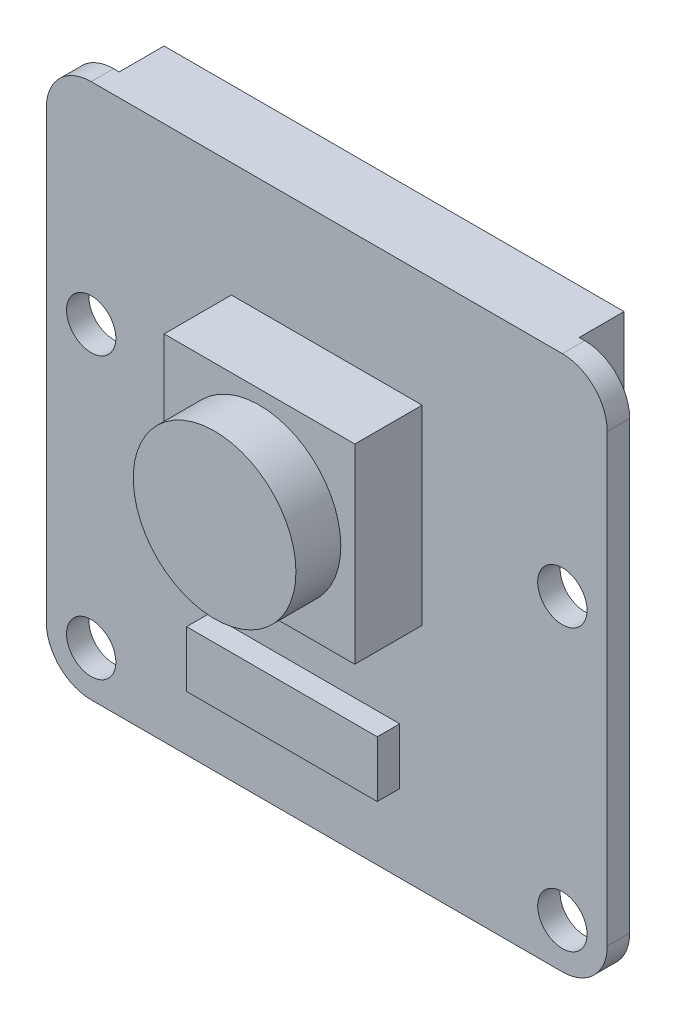
ISO-10303-21;
HEADER;
FILE_DESCRIPTION(('STEP AP214'),'2;1');
FILE_NAME('part.step','',(''),(''),'','','');
FILE_SCHEMA(('AUTOMOTIVE_DESIGN { 1 0 10303 214 1 1 1 1 }'));
ENDSEC;
DATA;
#1=APPLICATION_CONTEXT('core data for automotive mechanical design processes');
#2=APPLICATION_PROTOCOL_DEFINITION('international standard','automotive_design',2000,#1);
#3=PRODUCT_CONTEXT('',#1,'mechanical');
#4=PRODUCT('Part','Part','',(#3));
#5=PRODUCT_RELATED_PRODUCT_CATEGORY('part','',(#4));
#6=PRODUCT_DEFINITION_FORMATION('','',#4);
#7=PRODUCT_DEFINITION_CONTEXT('part definition',#1,'design');
#8=PRODUCT_DEFINITION('design','',#6,#7);
#9=PRODUCT_DEFINITION_SHAPE('','',#8);
#10=(LENGTH_UNIT() NAMED_UNIT(*) SI_UNIT(.MILLI.,.METRE.));
#11=(NAMED_UNIT(*) PLANE_ANGLE_UNIT() SI_UNIT($,.RADIAN.));
#12=(NAMED_UNIT(*) SI_UNIT($,.STERADIAN.) SOLID_ANGLE_UNIT());
#13=UNCERTAINTY_MEASURE_WITH_UNIT(LENGTH_MEASURE(1.E-05),#10,'distance_accuracy_value','');
#14=(GEOMETRIC_REPRESENTATION_CONTEXT(3) GLOBAL_UNCERTAINTY_ASSIGNED_CONTEXT((#13)) GLOBAL_UNIT_ASSIGNED_CONTEXT((#10,
#11,#12)) REPRESENTATION_CONTEXT('',''));
#15=CARTESIAN_POINT('',(0.,0.,0.));
#16=DIRECTION('',(0.,0.,1.));
#17=DIRECTION('',(1.,0.,0.));
#18=AXIS2_PLACEMENT_3D('',#15,#16,#17);
#19=CARTESIAN_POINT('',(0.,0.,0.));
#20=DIRECTION('',(0.,0.,1.));
#21=DIRECTION('',(1.,0.,0.));
#22=AXIS2_PLACEMENT_3D('',#19,#20,#21);
#23=PLANE('',#22);
#24=CARTESIAN_POINT('',(-10.5,-9.931,0.));
#25=DIRECTION('',(0.,0.,1.));
#26=DIRECTION('',(1.,0.,0.));
#27=AXIS2_PLACEMENT_3D('',#24,#25,#26);
#28=CIRCLE('',#27,1.1);
#29=CARTESIAN_POINT('',(-9.4,-9.931,0.));
#30=VERTEX_POINT('',#29);
#31=EDGE_CURVE('E284',#30,#30,#28,.T.);
#32=ORIENTED_EDGE('',*,*,#31,.T.);
#33=EDGE_LOOP('',(#32));
#34=FACE_BOUND('',#33,.T.);
#35=CARTESIAN_POINT('',(10.5,-9.931,0.));
#36=DIRECTION('',(0.,0.,1.));
#37=DIRECTION('',(1.,0.,0.));
#38=AXIS2_PLACEMENT_3D('',#35,#36,#37);
#39=CIRCLE('',#38,1.1);
#40=CARTESIAN_POINT('',(11.6,-9.931,0.));
#41=VERTEX_POINT('',#40);
#42=EDGE_CURVE('E266',#41,#41,#39,.T.);
#43=ORIENTED_EDGE('',*,*,#42,.T.);
#44=EDGE_LOOP('',(#43));
#45=FACE_BOUND('',#44,.T.);
#46=CARTESIAN_POINT('',(10.5,2.569,0.));
#47=DIRECTION('',(0.,0.,1.));
#48=DIRECTION('',(1.,0.,0.));
#49=AXIS2_PLACEMENT_3D('',#46,#47,#48);
#50=CIRCLE('',#49,1.1);
#51=CARTESIAN_POINT('',(11.6,2.569,0.));
#52=VERTEX_POINT('',#51);
#53=EDGE_CURVE('E273',#52,#52,#50,.T.);
#54=ORIENTED_EDGE('',*,*,#53,.T.);
#55=EDGE_LOOP('',(#54));
#56=FACE_BOUND('',#55,.T.);
#57=CARTESIAN_POINT('',(-10.5,2.569,0.));
#58=DIRECTION('',(0.,0.,1.));
#59=DIRECTION('',(1.,0.,0.));
#60=AXIS2_PLACEMENT_3D('',#57,#58,#59);
#61=CIRCLE('',#60,1.1);
#62=CARTESIAN_POINT('',(-9.4,2.569,0.));
#63=VERTEX_POINT('',#62);
#64=EDGE_CURVE('E279',#63,#63,#61,.T.);
#65=ORIENTED_EDGE('',*,*,#64,.T.);
#66=EDGE_LOOP('',(#65));
#67=FACE_BOUND('',#66,.T.);
#68=DIRECTION('',(0.,-1.,0.));
#69=VECTOR('',#68,1.);
#70=CARTESIAN_POINT('',(10.25,11.931,0.));
#71=LINE('',#70,#69);
#72=CARTESIAN_POINT('',(10.25,11.931,0.));
#73=VERTEX_POINT('',#72);
#74=CARTESIAN_POINT('',(10.25,6.431,0.));
#75=VERTEX_POINT('',#74);
#76=EDGE_CURVE('E195',#73,#75,#71,.T.);
#77=ORIENTED_EDGE('',*,*,#76,.F.);
#78=DIRECTION('',(-1.,0.,0.));
#79=VECTOR('',#78,1.);
#80=CARTESIAN_POINT('',(-12.5,11.931,0.));
#81=LINE('',#80,#79);
#82=CARTESIAN_POINT('',(10.5,11.931,0.));
#83=VERTEX_POINT('',#82);
#84=EDGE_CURVE('E306',#83,#73,#81,.T.);
#85=ORIENTED_EDGE('',*,*,#84,.F.);
#86=CARTESIAN_POINT('',(10.5,9.931,0.));
#87=DIRECTION('',(0.,0.,1.));
#88=DIRECTION('',(1.,0.,0.));
#89=AXIS2_PLACEMENT_3D('',#86,#87,#88);
#90=CIRCLE('',#89,2.);
#91=CARTESIAN_POINT('',(12.5,9.931,0.));
#92=VERTEX_POINT('',#91);
#93=EDGE_CURVE('E324',#83,#92,#90,.F.);
#94=ORIENTED_EDGE('',*,*,#93,.T.);
#95=DIRECTION('',(0.,1.,0.));
#96=VECTOR('',#95,1.);
#97=CARTESIAN_POINT('',(12.5,11.931,0.));
#98=LINE('',#97,#96);
#99=CARTESIAN_POINT('',(12.5,-9.931,0.));
#100=VERTEX_POINT('',#99);
#101=EDGE_CURVE('E287',#100,#92,#98,.T.);
#102=ORIENTED_EDGE('',*,*,#101,.F.);
#103=CARTESIAN_POINT('',(10.5,-9.931,0.));
#104=DIRECTION('',(0.,0.,1.));
#105=DIRECTION('',(1.,0.,0.));
#106=AXIS2_PLACEMENT_3D('',#103,#104,#105);
#107=CIRCLE('',#106,2.);
#108=CARTESIAN_POINT('',(10.5,-11.931,0.));
#109=VERTEX_POINT('',#108);
#110=EDGE_CURVE('E322',#100,#109,#107,.F.);
#111=ORIENTED_EDGE('',*,*,#110,.T.);
#112=DIRECTION('',(1.,0.,0.));
#113=VECTOR('',#112,1.);
#114=CARTESIAN_POINT('',(-12.5,-11.931,0.));
#115=LINE('',#114,#113);
#116=CARTESIAN_POINT('',(-10.5,-11.931,0.));
#117=VERTEX_POINT('',#116);
#118=EDGE_CURVE('E294',#117,#109,#115,.T.);
#119=ORIENTED_EDGE('',*,*,#118,.F.);
#120=CARTESIAN_POINT('',(-10.5,-9.931,0.));
#121=DIRECTION('',(0.,0.,1.));
#122=DIRECTION('',(1.,0.,0.));
#123=AXIS2_PLACEMENT_3D('',#120,#121,#122);
#124=CIRCLE('',#123,2.);
#125=CARTESIAN_POINT('',(-12.5,-9.931,0.));
#126=VERTEX_POINT('',#125);
#127=EDGE_CURVE('E320',#117,#126,#124,.F.);
#128=ORIENTED_EDGE('',*,*,#127,.T.);
#129=DIRECTION('',(0.,-1.,0.));
#130=VECTOR('',#129,1.);
#131=CARTESIAN_POINT('',(-12.5,11.931,0.));
#132=LINE('',#131,#130);
#133=CARTESIAN_POINT('',(-12.5,9.931,0.));
#134=VERTEX_POINT('',#133);
#135=EDGE_CURVE('E309',#134,#126,#132,.T.);
#136=ORIENTED_EDGE('',*,*,#135,.F.);
#137=CARTESIAN_POINT('',(-10.5,9.931,0.));
#138=DIRECTION('',(0.,0.,1.));
#139=DIRECTION('',(1.,0.,0.));
#140=AXIS2_PLACEMENT_3D('',#137,#138,#139);
#141=CIRCLE('',#140,2.);
#142=CARTESIAN_POINT('',(-10.5,11.931,0.));
#143=VERTEX_POINT('',#142);
#144=EDGE_CURVE('E318',#134,#143,#141,.F.);
#145=ORIENTED_EDGE('',*,*,#144,.T.);
#146=CARTESIAN_POINT('',(-10.25,11.931,0.));
#147=VERTEX_POINT('',#146);
#148=EDGE_CURVE('E58',#147,#143,#81,.T.);
#149=ORIENTED_EDGE('',*,*,#148,.F.);
#150=DIRECTION('',(0.,1.,0.));
#151=VECTOR('',#150,1.);
#152=CARTESIAN_POINT('',(-10.25,11.931,0.));
#153=LINE('',#152,#151);
#154=CARTESIAN_POINT('',(-10.25,6.431,0.));
#155=VERTEX_POINT('',#154);
#156=EDGE_CURVE('E192',#155,#147,#153,.T.);
#157=ORIENTED_EDGE('',*,*,#156,.F.);
#158=DIRECTION('',(-1.,0.,0.));
#159=VECTOR('',#158,1.);
#160=CARTESIAN_POINT('',(10.25,6.431,0.));
#161=LINE('',#160,#159);
#162=EDGE_CURVE('E52',#75,#155,#161,.T.);
#163=ORIENTED_EDGE('',*,*,#162,.F.);
#164=EDGE_LOOP('',(#77,#85,#94,#102,#111,#119,#128,#136,#145,#149,#157,#163));
#165=FACE_BOUND('',#164,.T.);
#166=ADVANCED_FACE('F36',(#34,#45,#56,#67,#165),#23,.F.);
#167=CARTESIAN_POINT('',(0.,0.,1.));
#168=DIRECTION('',(0.,0.,1.));
#169=DIRECTION('',(1.,0.,0.));
#170=AXIS2_PLACEMENT_3D('',#167,#168,#169);
#171=PLANE('',#170);
#172=CARTESIAN_POINT('',(-10.5,2.569,1.));
#173=DIRECTION('',(0.,0.,1.));
#174=DIRECTION('',(1.,0.,0.));
#175=AXIS2_PLACEMENT_3D('',#172,#173,#174);
#176=CIRCLE('',#175,1.1);
#177=CARTESIAN_POINT('',(-9.4,2.569,1.));
#178=VERTEX_POINT('',#177);
#179=EDGE_CURVE('E265',#178,#178,#176,.T.);
#180=ORIENTED_EDGE('',*,*,#179,.F.);
#181=EDGE_LOOP('',(#180));
#182=FACE_BOUND('',#181,.T.);
#183=CARTESIAN_POINT('',(10.5,2.569,1.));
#184=DIRECTION('',(0.,0.,1.));
#185=DIRECTION('',(1.,0.,0.));
#186=AXIS2_PLACEMENT_3D('',#183,#184,#185);
#187=CIRCLE('',#186,1.1);
#188=CARTESIAN_POINT('',(11.6,2.569,1.));
#189=VERTEX_POINT('',#188);
#190=EDGE_CURVE('E276',#189,#189,#187,.T.);
#191=ORIENTED_EDGE('',*,*,#190,.F.);
#192=EDGE_LOOP('',(#191));
#193=FACE_BOUND('',#192,.T.);
#194=CARTESIAN_POINT('',(10.5,-9.931,1.));
#195=DIRECTION('',(0.,0.,1.));
#196=DIRECTION('',(1.,0.,0.));
#197=AXIS2_PLACEMENT_3D('',#194,#195,#196);
#198=CIRCLE('',#197,1.1);
#199=CARTESIAN_POINT('',(11.6,-9.931,1.));
#200=VERTEX_POINT('',#199);
#201=EDGE_CURVE('E270',#200,#200,#198,.T.);
#202=ORIENTED_EDGE('',*,*,#201,.F.);
#203=EDGE_LOOP('',(#202));
#204=FACE_BOUND('',#203,.T.);
#205=CARTESIAN_POINT('',(-10.5,-9.931,1.));
#206=DIRECTION('',(0.,0.,1.));
#207=DIRECTION('',(1.,0.,0.));
#208=AXIS2_PLACEMENT_3D('',#205,#206,#207);
#209=CIRCLE('',#208,1.1);
#210=CARTESIAN_POINT('',(-9.4,-9.931,1.));
#211=VERTEX_POINT('',#210);
#212=EDGE_CURVE('E269',#211,#211,#209,.T.);
#213=ORIENTED_EDGE('',*,*,#212,.F.);
#214=EDGE_LOOP('',(#213));
#215=FACE_BOUND('',#214,.T.);
#216=DIRECTION('',(0.,1.,0.));
#217=VECTOR('',#216,1.);
#218=CARTESIAN_POINT('',(12.5,11.931,1.));
#219=LINE('',#218,#217);
#220=CARTESIAN_POINT('',(12.5,-9.931,1.));
#221=VERTEX_POINT('',#220);
#222=CARTESIAN_POINT('',(12.5,9.931,1.));
#223=VERTEX_POINT('',#222);
#224=EDGE_CURVE('E290',#221,#223,#219,.T.);
#225=ORIENTED_EDGE('',*,*,#224,.T.);
#226=CARTESIAN_POINT('',(10.5,9.931,1.));
#227=DIRECTION('',(0.,0.,1.));
#228=DIRECTION('',(1.,0.,0.));
#229=AXIS2_PLACEMENT_3D('',#226,#227,#228);
#230=CIRCLE('',#229,2.);
#231=CARTESIAN_POINT('',(10.5,11.931,1.));
#232=VERTEX_POINT('',#231);
#233=EDGE_CURVE('E337',#223,#232,#230,.T.);
#234=ORIENTED_EDGE('',*,*,#233,.T.);
#235=DIRECTION('',(-1.,0.,0.));
#236=VECTOR('',#235,1.);
#237=CARTESIAN_POINT('',(-12.5,11.931,1.));
#238=LINE('',#237,#236);
#239=CARTESIAN_POINT('',(-10.5,11.931,1.));
#240=VERTEX_POINT('',#239);
#241=EDGE_CURVE('E293',#232,#240,#238,.T.);
#242=ORIENTED_EDGE('',*,*,#241,.T.);
#243=CARTESIAN_POINT('',(-10.5,9.931,1.));
#244=DIRECTION('',(0.,0.,1.));
#245=DIRECTION('',(1.,0.,0.));
#246=AXIS2_PLACEMENT_3D('',#243,#244,#245);
#247=CIRCLE('',#246,2.);
#248=CARTESIAN_POINT('',(-12.5,9.931,1.));
#249=VERTEX_POINT('',#248);
#250=EDGE_CURVE('E331',#240,#249,#247,.T.);
#251=ORIENTED_EDGE('',*,*,#250,.T.);
#252=DIRECTION('',(0.,-1.,0.));
#253=VECTOR('',#252,1.);
#254=CARTESIAN_POINT('',(-12.5,11.931,1.));
#255=LINE('',#254,#253);
#256=CARTESIAN_POINT('',(-12.5,-9.931,1.));
#257=VERTEX_POINT('',#256);
#258=EDGE_CURVE('E297',#249,#257,#255,.T.);
#259=ORIENTED_EDGE('',*,*,#258,.T.);
#260=CARTESIAN_POINT('',(-10.5,-9.931,1.));
#261=DIRECTION('',(0.,0.,1.));
#262=DIRECTION('',(1.,0.,0.));
#263=AXIS2_PLACEMENT_3D('',#260,#261,#262);
#264=CIRCLE('',#263,2.);
#265=CARTESIAN_POINT('',(-10.5,-11.931,1.));
#266=VERTEX_POINT('',#265);
#267=EDGE_CURVE('E333',#257,#266,#264,.T.);
#268=ORIENTED_EDGE('',*,*,#267,.T.);
#269=DIRECTION('',(1.,0.,0.));
#270=VECTOR('',#269,1.);
#271=CARTESIAN_POINT('',(-12.5,-11.931,1.));
#272=LINE('',#271,#270);
#273=CARTESIAN_POINT('',(10.5,-11.931,1.));
#274=VERTEX_POINT('',#273);
#275=EDGE_CURVE('E300',#266,#274,#272,.T.);
#276=ORIENTED_EDGE('',*,*,#275,.T.);
#277=CARTESIAN_POINT('',(10.5,-9.931,1.));
#278=DIRECTION('',(0.,0.,1.));
#279=DIRECTION('',(1.,0.,0.));
#280=AXIS2_PLACEMENT_3D('',#277,#278,#279);
#281=CIRCLE('',#280,2.);
#282=EDGE_CURVE('E335',#274,#221,#281,.T.);
#283=ORIENTED_EDGE('',*,*,#282,.T.);
#284=EDGE_LOOP('',(#225,#234,#242,#251,#259,#268,#276,#283));
#285=FACE_BOUND('',#284,.T.);
#286=DIRECTION('',(-1.,0.,0.));
#287=VECTOR('',#286,1.);
#288=CARTESIAN_POINT('',(-5.24999999999999,-5.981,1.));
#289=LINE('',#288,#287);
#290=CARTESIAN_POINT('',(3.25000000000001,-5.981,1.));
#291=VERTEX_POINT('',#290);
#292=CARTESIAN_POINT('',(-5.24999999999999,-5.981,1.));
#293=VERTEX_POINT('',#292);
#294=EDGE_CURVE('E250',#291,#293,#289,.T.);
#295=ORIENTED_EDGE('',*,*,#294,.F.);
#296=DIRECTION('',(0.,1.,0.));
#297=VECTOR('',#296,1.);
#298=CARTESIAN_POINT('',(3.25000000000001,-5.981,1.));
#299=LINE('',#298,#297);
#300=CARTESIAN_POINT('',(3.25000000000001,-8.481,1.));
#301=VERTEX_POINT('',#300);
#302=EDGE_CURVE('E236',#301,#291,#299,.T.);
#303=ORIENTED_EDGE('',*,*,#302,.F.);
#304=DIRECTION('',(1.,0.,0.));
#305=VECTOR('',#304,1.);
#306=CARTESIAN_POINT('',(-5.24999999999999,-8.481,1.));
#307=LINE('',#306,#305);
#308=CARTESIAN_POINT('',(-5.24999999999999,-8.481,1.));
#309=VERTEX_POINT('',#308);
#310=EDGE_CURVE('E241',#309,#301,#307,.T.);
#311=ORIENTED_EDGE('',*,*,#310,.F.);
#312=DIRECTION('',(0.,-1.,0.));
#313=VECTOR('',#312,1.);
#314=CARTESIAN_POINT('',(-5.24999999999999,-5.981,1.));
#315=LINE('',#314,#313);
#316=EDGE_CURVE('E252',#293,#309,#315,.T.);
#317=ORIENTED_EDGE('',*,*,#316,.F.);
#318=EDGE_LOOP('',(#295,#303,#311,#317));
#319=FACE_BOUND('',#318,.T.);
#320=DIRECTION('',(-1.,0.,0.));
#321=VECTOR('',#320,1.);
#322=CARTESIAN_POINT('',(-4.25,6.819,1.));
#323=LINE('',#322,#321);
#324=CARTESIAN_POINT('',(4.25,6.819,1.));
#325=VERTEX_POINT('',#324);
#326=CARTESIAN_POINT('',(-4.25,6.819,1.));
#327=VERTEX_POINT('',#326);
#328=EDGE_CURVE('E219',#325,#327,#323,.T.);
#329=ORIENTED_EDGE('',*,*,#328,.F.);
#330=DIRECTION('',(0.,1.,0.));
#331=VECTOR('',#330,1.);
#332=CARTESIAN_POINT('',(4.25,6.819,1.));
#333=LINE('',#332,#331);
#334=CARTESIAN_POINT('',(4.25000000000001,-1.681,1.));
#335=VERTEX_POINT('',#334);
#336=EDGE_CURVE('E216',#335,#325,#333,.T.);
#337=ORIENTED_EDGE('',*,*,#336,.F.);
#338=DIRECTION('',(1.,0.,0.));
#339=VECTOR('',#338,1.);
#340=CARTESIAN_POINT('',(-4.24999999999999,-1.681,1.));
#341=LINE('',#340,#339);
#342=CARTESIAN_POINT('',(-4.24999999999999,-1.681,1.));
#343=VERTEX_POINT('',#342);
#344=EDGE_CURVE('E224',#343,#335,#341,.T.);
#345=ORIENTED_EDGE('',*,*,#344,.F.);
#346=DIRECTION('',(0.,-1.,0.));
#347=VECTOR('',#346,1.);
#348=CARTESIAN_POINT('',(-4.25,6.819,1.));
#349=LINE('',#348,#347);
#350=EDGE_CURVE('E221',#327,#343,#349,.T.);
#351=ORIENTED_EDGE('',*,*,#350,.F.);
#352=EDGE_LOOP('',(#329,#337,#345,#351));
#353=FACE_BOUND('',#352,.T.);
#354=ADVANCED_FACE('F354',(#182,#193,#204,#215,#285,#319,#353),#171,.T.);
#355=CARTESIAN_POINT('',(12.5,11.931,1.));
#356=DIRECTION('',(-1.,0.,0.));
#357=DIRECTION('',(0.,-1.,0.));
#358=AXIS2_PLACEMENT_3D('',#355,#356,#357);
#359=PLANE('',#358);
#360=ORIENTED_EDGE('',*,*,#101,.T.);
#361=DIRECTION('',(0.,0.,-1.));
#362=VECTOR('',#361,1.);
#363=CARTESIAN_POINT('',(12.5,9.931,1.));
#364=LINE('',#363,#362);
#365=EDGE_CURVE('E329',#92,#223,#364,.F.);
#366=ORIENTED_EDGE('',*,*,#365,.T.);
#367=ORIENTED_EDGE('',*,*,#224,.F.);
#368=DIRECTION('',(0.,0.,-1.));
#369=VECTOR('',#368,1.);
#370=CARTESIAN_POINT('',(12.5,-9.931,1.));
#371=LINE('',#370,#369);
#372=EDGE_CURVE('E326',#221,#100,#371,.T.);
#373=ORIENTED_EDGE('',*,*,#372,.T.);
#374=EDGE_LOOP('',(#360,#366,#367,#373));
#375=FACE_BOUND('',#374,.T.);
#376=ADVANCED_FACE('F371',(#375),#359,.F.);
#377=CARTESIAN_POINT('',(-12.5,11.931,1.));
#378=DIRECTION('',(0.,-1.,0.));
#379=DIRECTION('',(0.,0.,-1.));
#380=AXIS2_PLACEMENT_3D('',#377,#378,#379);
#381=PLANE('',#380);
#382=ORIENTED_EDGE('',*,*,#241,.F.);
#383=DIRECTION('',(0.,0.,-1.));
#384=VECTOR('',#383,1.);
#385=CARTESIAN_POINT('',(10.5,11.931,1.));
#386=LINE('',#385,#384);
#387=EDGE_CURVE('E315',#232,#83,#386,.T.);
#388=ORIENTED_EDGE('',*,*,#387,.T.);
#389=ORIENTED_EDGE('',*,*,#84,.T.);
#390=DIRECTION('',(0.,0.,1.));
#391=VECTOR('',#390,1.);
#392=CARTESIAN_POINT('',(10.25,11.931,-2.));
#393=LINE('',#392,#391);
#394=CARTESIAN_POINT('',(10.25,11.931,-2.));
#395=VERTEX_POINT('',#394);
#396=EDGE_CURVE('E387',#395,#73,#393,.T.);
#397=ORIENTED_EDGE('',*,*,#396,.F.);
#398=DIRECTION('',(1.,0.,0.));
#399=VECTOR('',#398,1.);
#400=CARTESIAN_POINT('',(10.25,11.931,-2.));
#401=LINE('',#400,#399);
#402=CARTESIAN_POINT('',(-10.25,11.931,-2.));
#403=VERTEX_POINT('',#402);
#404=EDGE_CURVE('E188',#403,#395,#401,.T.);
#405=ORIENTED_EDGE('',*,*,#404,.F.);
#406=DIRECTION('',(0.,0.,1.));
#407=VECTOR('',#406,1.);
#408=CARTESIAN_POINT('',(-10.25,11.931,-2.));
#409=LINE('',#408,#407);
#410=EDGE_CURVE('E201',#403,#147,#409,.T.);
#411=ORIENTED_EDGE('',*,*,#410,.T.);
#412=ORIENTED_EDGE('',*,*,#148,.T.);
#413=DIRECTION('',(0.,0.,-1.));
#414=VECTOR('',#413,1.);
#415=CARTESIAN_POINT('',(-10.5,11.931,1.));
#416=LINE('',#415,#414);
#417=EDGE_CURVE('E303',#143,#240,#416,.F.);
#418=ORIENTED_EDGE('',*,*,#417,.T.);
#419=EDGE_LOOP('',(#382,#388,#389,#397,#405,#411,#412,#418));
#420=FACE_BOUND('',#419,.T.);
#421=ADVANCED_FACE('F380',(#420),#381,.F.);
#422=CARTESIAN_POINT('',(-12.5,11.931,1.));
#423=DIRECTION('',(1.,0.,0.));
#424=DIRECTION('',(0.,1.,0.));
#425=AXIS2_PLACEMENT_3D('',#422,#423,#424);
#426=PLANE('',#425);
#427=ORIENTED_EDGE('',*,*,#135,.T.);
#428=DIRECTION('',(0.,0.,-1.));
#429=VECTOR('',#428,1.);
#430=CARTESIAN_POINT('',(-12.5,-9.931,1.));
#431=LINE('',#430,#429);
#432=EDGE_CURVE('E40',#126,#257,#431,.F.);
#433=ORIENTED_EDGE('',*,*,#432,.T.);
#434=ORIENTED_EDGE('',*,*,#258,.F.);
#435=DIRECTION('',(0.,0.,-1.));
#436=VECTOR('',#435,1.);
#437=CARTESIAN_POINT('',(-12.5,9.931,1.));
#438=LINE('',#437,#436);
#439=EDGE_CURVE('E343',#249,#134,#438,.T.);
#440=ORIENTED_EDGE('',*,*,#439,.T.);
#441=EDGE_LOOP('',(#427,#433,#434,#440));
#442=FACE_BOUND('',#441,.T.);
#443=ADVANCED_FACE('F350',(#442),#426,.F.);
#444=CARTESIAN_POINT('',(-12.5,-11.931,1.));
#445=DIRECTION('',(0.,1.,0.));
#446=DIRECTION('',(0.,0.,1.));
#447=AXIS2_PLACEMENT_3D('',#444,#445,#446);
#448=PLANE('',#447);
#449=ORIENTED_EDGE('',*,*,#118,.T.);
#450=DIRECTION('',(0.,0.,-1.));
#451=VECTOR('',#450,1.);
#452=CARTESIAN_POINT('',(10.5,-11.931,1.));
#453=LINE('',#452,#451);
#454=EDGE_CURVE('E342',#109,#274,#453,.F.);
#455=ORIENTED_EDGE('',*,*,#454,.T.);
#456=ORIENTED_EDGE('',*,*,#275,.F.);
#457=DIRECTION('',(0.,0.,-1.));
#458=VECTOR('',#457,1.);
#459=CARTESIAN_POINT('',(-10.5,-11.931,1.));
#460=LINE('',#459,#458);
#461=EDGE_CURVE('E339',#266,#117,#460,.T.);
#462=ORIENTED_EDGE('',*,*,#461,.T.);
#463=EDGE_LOOP('',(#449,#455,#456,#462));
#464=FACE_BOUND('',#463,.T.);
#465=ADVANCED_FACE('F362',(#464),#448,.F.);
#466=CARTESIAN_POINT('',(10.5,9.931,1.));
#467=DIRECTION('',(0.,0.,-1.));
#468=DIRECTION('',(-1.,0.,0.));
#469=AXIS2_PLACEMENT_3D('',#466,#467,#468);
#470=CYLINDRICAL_SURFACE('',#469,2.);
#471=ORIENTED_EDGE('',*,*,#233,.F.);
#472=ORIENTED_EDGE('',*,*,#365,.F.);
#473=ORIENTED_EDGE('',*,*,#93,.F.);
#474=ORIENTED_EDGE('',*,*,#387,.F.);
#475=EDGE_LOOP('',(#471,#472,#473,#474));
#476=FACE_BOUND('',#475,.T.);
#477=ADVANCED_FACE('F377',(#476),#470,.T.);
#478=CARTESIAN_POINT('',(10.5,-9.931,1.));
#479=DIRECTION('',(0.,0.,-1.));
#480=DIRECTION('',(-1.,0.,0.));
#481=AXIS2_PLACEMENT_3D('',#478,#479,#480);
#482=CYLINDRICAL_SURFACE('',#481,2.);
#483=ORIENTED_EDGE('',*,*,#282,.F.);
#484=ORIENTED_EDGE('',*,*,#454,.F.);
#485=ORIENTED_EDGE('',*,*,#110,.F.);
#486=ORIENTED_EDGE('',*,*,#372,.F.);
#487=EDGE_LOOP('',(#483,#484,#485,#486));
#488=FACE_BOUND('',#487,.T.);
#489=ADVANCED_FACE('F368',(#488),#482,.T.);
#490=CARTESIAN_POINT('',(-10.5,-9.931,1.));
#491=DIRECTION('',(0.,0.,-1.));
#492=DIRECTION('',(-1.,0.,0.));
#493=AXIS2_PLACEMENT_3D('',#490,#491,#492);
#494=CYLINDRICAL_SURFACE('',#493,2.);
#495=ORIENTED_EDGE('',*,*,#267,.F.);
#496=ORIENTED_EDGE('',*,*,#432,.F.);
#497=ORIENTED_EDGE('',*,*,#127,.F.);
#498=ORIENTED_EDGE('',*,*,#461,.F.);
#499=EDGE_LOOP('',(#495,#496,#497,#498));
#500=FACE_BOUND('',#499,.T.);
#501=ADVANCED_FACE('F359',(#500),#494,.T.);
#502=CARTESIAN_POINT('',(-10.5,9.931,1.));
#503=DIRECTION('',(0.,0.,-1.));
#504=DIRECTION('',(-1.,0.,0.));
#505=AXIS2_PLACEMENT_3D('',#502,#503,#504);
#506=CYLINDRICAL_SURFACE('',#505,2.);
#507=ORIENTED_EDGE('',*,*,#250,.F.);
#508=ORIENTED_EDGE('',*,*,#417,.F.);
#509=ORIENTED_EDGE('',*,*,#144,.F.);
#510=ORIENTED_EDGE('',*,*,#439,.F.);
#511=EDGE_LOOP('',(#507,#508,#509,#510));
#512=FACE_BOUND('',#511,.T.);
#513=ADVANCED_FACE('F38',(#512),#506,.T.);
#514=CARTESIAN_POINT('',(-10.5,-9.931,0.));
#515=DIRECTION('',(0.,0.,1.));
#516=DIRECTION('',(1.,0.,0.));
#517=AXIS2_PLACEMENT_3D('',#514,#515,#516);
#518=CYLINDRICAL_SURFACE('',#517,1.1);
#519=ORIENTED_EDGE('',*,*,#31,.F.);
#520=EDGE_LOOP('',(#519));
#521=FACE_BOUND('',#520,.T.);
#522=ORIENTED_EDGE('',*,*,#212,.T.);
#523=EDGE_LOOP('',(#522));
#524=FACE_BOUND('',#523,.T.);
#525=ADVANCED_FACE('F426',(#521,#524),#518,.F.);
#526=CARTESIAN_POINT('',(10.5,-9.931,0.));
#527=DIRECTION('',(0.,0.,1.));
#528=DIRECTION('',(1.,0.,0.));
#529=AXIS2_PLACEMENT_3D('',#526,#527,#528);
#530=CYLINDRICAL_SURFACE('',#529,1.1);
#531=ORIENTED_EDGE('',*,*,#42,.F.);
#532=EDGE_LOOP('',(#531));
#533=FACE_BOUND('',#532,.T.);
#534=ORIENTED_EDGE('',*,*,#201,.T.);
#535=EDGE_LOOP('',(#534));
#536=FACE_BOUND('',#535,.T.);
#537=ADVANCED_FACE('F431',(#533,#536),#530,.F.);
#538=CARTESIAN_POINT('',(10.5,2.569,0.));
#539=DIRECTION('',(0.,0.,1.));
#540=DIRECTION('',(1.,0.,0.));
#541=AXIS2_PLACEMENT_3D('',#538,#539,#540);
#542=CYLINDRICAL_SURFACE('',#541,1.1);
#543=ORIENTED_EDGE('',*,*,#53,.F.);
#544=EDGE_LOOP('',(#543));
#545=FACE_BOUND('',#544,.T.);
#546=ORIENTED_EDGE('',*,*,#190,.T.);
#547=EDGE_LOOP('',(#546));
#548=FACE_BOUND('',#547,.T.);
#549=ADVANCED_FACE('F437',(#545,#548),#542,.F.);
#550=CARTESIAN_POINT('',(-10.5,2.569,0.));
#551=DIRECTION('',(0.,0.,1.));
#552=DIRECTION('',(1.,0.,0.));
#553=AXIS2_PLACEMENT_3D('',#550,#551,#552);
#554=CYLINDRICAL_SURFACE('',#553,1.1);
#555=ORIENTED_EDGE('',*,*,#64,.F.);
#556=EDGE_LOOP('',(#555));
#557=FACE_BOUND('',#556,.T.);
#558=ORIENTED_EDGE('',*,*,#179,.T.);
#559=EDGE_LOOP('',(#558));
#560=FACE_BOUND('',#559,.T.);
#561=ADVANCED_FACE('F443',(#557,#560),#554,.F.);
#562=CARTESIAN_POINT('',(3.25000000000001,-5.981,2.));
#563=DIRECTION('',(-1.,0.,0.));
#564=DIRECTION('',(0.,0.,1.));
#565=AXIS2_PLACEMENT_3D('',#562,#563,#564);
#566=PLANE('',#565);
#567=ORIENTED_EDGE('',*,*,#302,.T.);
#568=DIRECTION('',(0.,0.,-1.));
#569=VECTOR('',#568,1.);
#570=CARTESIAN_POINT('',(3.25000000000001,-5.981,2.));
#571=LINE('',#570,#569);
#572=CARTESIAN_POINT('',(3.25000000000001,-5.981,2.));
#573=VERTEX_POINT('',#572);
#574=EDGE_CURVE('E263',#573,#291,#571,.T.);
#575=ORIENTED_EDGE('',*,*,#574,.F.);
#576=DIRECTION('',(0.,1.,0.));
#577=VECTOR('',#576,1.);
#578=CARTESIAN_POINT('',(3.25000000000001,-5.981,2.));
#579=LINE('',#578,#577);
#580=CARTESIAN_POINT('',(3.25000000000001,-8.481,2.));
#581=VERTEX_POINT('',#580);
#582=EDGE_CURVE('E237',#581,#573,#579,.T.);
#583=ORIENTED_EDGE('',*,*,#582,.F.);
#584=DIRECTION('',(0.,0.,-1.));
#585=VECTOR('',#584,1.);
#586=CARTESIAN_POINT('',(3.25000000000001,-8.481,2.));
#587=LINE('',#586,#585);
#588=EDGE_CURVE('E247',#581,#301,#587,.T.);
#589=ORIENTED_EDGE('',*,*,#588,.T.);
#590=EDGE_LOOP('',(#567,#575,#583,#589));
#591=FACE_BOUND('',#590,.T.);
#592=ADVANCED_FACE('F446',(#591),#566,.F.);
#593=CARTESIAN_POINT('',(-5.24999999999999,-5.981,2.));
#594=DIRECTION('',(0.,-1.,0.));
#595=DIRECTION('',(0.,0.,-1.));
#596=AXIS2_PLACEMENT_3D('',#593,#594,#595);
#597=PLANE('',#596);
#598=ORIENTED_EDGE('',*,*,#294,.T.);
#599=DIRECTION('',(0.,0.,-1.));
#600=VECTOR('',#599,1.);
#601=CARTESIAN_POINT('',(-5.24999999999999,-5.981,2.));
#602=LINE('',#601,#600);
#603=CARTESIAN_POINT('',(-5.24999999999999,-5.981,2.));
#604=VERTEX_POINT('',#603);
#605=EDGE_CURVE('E260',#604,#293,#602,.T.);
#606=ORIENTED_EDGE('',*,*,#605,.F.);
#607=DIRECTION('',(-1.,0.,0.));
#608=VECTOR('',#607,1.);
#609=CARTESIAN_POINT('',(-5.24999999999999,-5.981,2.));
#610=LINE('',#609,#608);
#611=EDGE_CURVE('E240',#573,#604,#610,.T.);
#612=ORIENTED_EDGE('',*,*,#611,.F.);
#613=ORIENTED_EDGE('',*,*,#574,.T.);
#614=EDGE_LOOP('',(#598,#606,#612,#613));
#615=FACE_BOUND('',#614,.T.);
#616=ADVANCED_FACE('F453',(#615),#597,.F.);
#617=CARTESIAN_POINT('',(-5.24999999999999,-5.981,2.));
#618=DIRECTION('',(1.,0.,0.));
#619=DIRECTION('',(0.,0.,-1.));
#620=AXIS2_PLACEMENT_3D('',#617,#618,#619);
#621=PLANE('',#620);
#622=ORIENTED_EDGE('',*,*,#316,.T.);
#623=DIRECTION('',(0.,0.,-1.));
#624=VECTOR('',#623,1.);
#625=CARTESIAN_POINT('',(-5.24999999999999,-8.481,2.));
#626=LINE('',#625,#624);
#627=CARTESIAN_POINT('',(-5.24999999999999,-8.481,2.));
#628=VERTEX_POINT('',#627);
#629=EDGE_CURVE('E258',#628,#309,#626,.T.);
#630=ORIENTED_EDGE('',*,*,#629,.F.);
#631=DIRECTION('',(0.,-1.,0.));
#632=VECTOR('',#631,1.);
#633=CARTESIAN_POINT('',(-5.24999999999999,-5.981,2.));
#634=LINE('',#633,#632);
#635=EDGE_CURVE('E243',#604,#628,#634,.T.);
#636=ORIENTED_EDGE('',*,*,#635,.F.);
#637=ORIENTED_EDGE('',*,*,#605,.T.);
#638=EDGE_LOOP('',(#622,#630,#636,#637));
#639=FACE_BOUND('',#638,.T.);
#640=ADVANCED_FACE('F457',(#639),#621,.F.);
#641=CARTESIAN_POINT('',(-5.24999999999999,-8.481,2.));
#642=DIRECTION('',(0.,1.,0.));
#643=DIRECTION('',(0.,0.,1.));
#644=AXIS2_PLACEMENT_3D('',#641,#642,#643);
#645=PLANE('',#644);
#646=ORIENTED_EDGE('',*,*,#310,.T.);
#647=ORIENTED_EDGE('',*,*,#588,.F.);
#648=DIRECTION('',(1.,0.,0.));
#649=VECTOR('',#648,1.);
#650=CARTESIAN_POINT('',(-5.24999999999999,-8.481,2.));
#651=LINE('',#650,#649);
#652=EDGE_CURVE('E245',#628,#581,#651,.T.);
#653=ORIENTED_EDGE('',*,*,#652,.F.);
#654=ORIENTED_EDGE('',*,*,#629,.T.);
#655=EDGE_LOOP('',(#646,#647,#653,#654));
#656=FACE_BOUND('',#655,.T.);
#657=ADVANCED_FACE('F461',(#656),#645,.F.);
#658=CARTESIAN_POINT('',(0.,0.,2.));
#659=DIRECTION('',(0.,0.,1.));
#660=DIRECTION('',(1.,0.,0.));
#661=AXIS2_PLACEMENT_3D('',#658,#659,#660);
#662=PLANE('',#661);
#663=ORIENTED_EDGE('',*,*,#582,.T.);
#664=ORIENTED_EDGE('',*,*,#611,.T.);
#665=ORIENTED_EDGE('',*,*,#635,.T.);
#666=ORIENTED_EDGE('',*,*,#652,.T.);
#667=EDGE_LOOP('',(#663,#664,#665,#666));
#668=FACE_BOUND('',#667,.T.);
#669=ADVANCED_FACE('F465',(#668),#662,.T.);
#670=CARTESIAN_POINT('',(4.25,6.819,2.));
#671=DIRECTION('',(-1.,0.,0.));
#672=DIRECTION('',(0.,-1.,0.));
#673=AXIS2_PLACEMENT_3D('',#670,#671,#672);
#674=PLANE('',#673);
#675=ORIENTED_EDGE('',*,*,#336,.T.);
#676=DIRECTION('',(0.,0.,-1.));
#677=VECTOR('',#676,1.);
#678=CARTESIAN_POINT('',(4.25,6.819,2.));
#679=LINE('',#678,#677);
#680=CARTESIAN_POINT('',(4.25000000000001,6.819,4.));
#681=VERTEX_POINT('',#680);
#682=EDGE_CURVE('E234',#681,#325,#679,.T.);
#683=ORIENTED_EDGE('',*,*,#682,.F.);
#684=DIRECTION('',(0.,1.,0.));
#685=VECTOR('',#684,1.);
#686=CARTESIAN_POINT('',(4.25000000000001,6.819,4.));
#687=LINE('',#686,#685);
#688=CARTESIAN_POINT('',(4.25000000000001,-1.681,4.));
#689=VERTEX_POINT('',#688);
#690=EDGE_CURVE('E210',#689,#681,#687,.T.);
#691=ORIENTED_EDGE('',*,*,#690,.F.);
#692=DIRECTION('',(0.,0.,-1.));
#693=VECTOR('',#692,1.);
#694=CARTESIAN_POINT('',(4.25000000000001,-1.681,2.));
#695=LINE('',#694,#693);
#696=EDGE_CURVE('E226',#689,#335,#695,.T.);
#697=ORIENTED_EDGE('',*,*,#696,.T.);
#698=EDGE_LOOP('',(#675,#683,#691,#697));
#699=FACE_BOUND('',#698,.T.);
#700=ADVANCED_FACE('F469',(#699),#674,.F.);
#701=CARTESIAN_POINT('',(-4.25,6.819,2.));
#702=DIRECTION('',(0.,-1.,0.));
#703=DIRECTION('',(0.,0.,-1.));
#704=AXIS2_PLACEMENT_3D('',#701,#702,#703);
#705=PLANE('',#704);
#706=ORIENTED_EDGE('',*,*,#328,.T.);
#707=DIRECTION('',(0.,0.,-1.));
#708=VECTOR('',#707,1.);
#709=CARTESIAN_POINT('',(-4.25,6.819,2.));
#710=LINE('',#709,#708);
#711=CARTESIAN_POINT('',(-4.25,6.819,4.));
#712=VERTEX_POINT('',#711);
#713=EDGE_CURVE('E231',#712,#327,#710,.T.);
#714=ORIENTED_EDGE('',*,*,#713,.F.);
#715=DIRECTION('',(-1.,0.,0.));
#716=VECTOR('',#715,1.);
#717=CARTESIAN_POINT('',(-4.25,6.819,4.));
#718=LINE('',#717,#716);
#719=EDGE_CURVE('E213',#681,#712,#718,.T.);
#720=ORIENTED_EDGE('',*,*,#719,.F.);
#721=ORIENTED_EDGE('',*,*,#682,.T.);
#722=EDGE_LOOP('',(#706,#714,#720,#721));
#723=FACE_BOUND('',#722,.T.);
#724=ADVANCED_FACE('F473',(#723),#705,.F.);
#725=CARTESIAN_POINT('',(-4.25,6.819,2.));
#726=DIRECTION('',(1.,0.,0.));
#727=DIRECTION('',(0.,1.,0.));
#728=AXIS2_PLACEMENT_3D('',#725,#726,#727);
#729=PLANE('',#728);
#730=ORIENTED_EDGE('',*,*,#350,.T.);
#731=DIRECTION('',(0.,0.,-1.));
#732=VECTOR('',#731,1.);
#733=CARTESIAN_POINT('',(-4.24999999999999,-1.681,2.));
#734=LINE('',#733,#732);
#735=CARTESIAN_POINT('',(-4.25,-1.681,4.));
#736=VERTEX_POINT('',#735);
#737=EDGE_CURVE('E229',#736,#343,#734,.T.);
#738=ORIENTED_EDGE('',*,*,#737,.F.);
#739=DIRECTION('',(0.,-1.,0.));
#740=VECTOR('',#739,1.);
#741=CARTESIAN_POINT('',(-4.25,6.819,4.));
#742=LINE('',#741,#740);
#743=EDGE_CURVE('E199',#712,#736,#742,.T.);
#744=ORIENTED_EDGE('',*,*,#743,.F.);
#745=ORIENTED_EDGE('',*,*,#713,.T.);
#746=EDGE_LOOP('',(#730,#738,#744,#745));
#747=FACE_BOUND('',#746,.T.);
#748=ADVANCED_FACE('F477',(#747),#729,.F.);
#749=CARTESIAN_POINT('',(-4.24999999999999,-1.681,2.));
#750=DIRECTION('',(0.,1.,0.));
#751=DIRECTION('',(0.,0.,1.));
#752=AXIS2_PLACEMENT_3D('',#749,#750,#751);
#753=PLANE('',#752);
#754=ORIENTED_EDGE('',*,*,#344,.T.);
#755=ORIENTED_EDGE('',*,*,#696,.F.);
#756=DIRECTION('',(1.,0.,0.));
#757=VECTOR('',#756,1.);
#758=CARTESIAN_POINT('',(-4.25,-1.681,4.));
#759=LINE('',#758,#757);
#760=EDGE_CURVE('E207',#736,#689,#759,.T.);
#761=ORIENTED_EDGE('',*,*,#760,.F.);
#762=ORIENTED_EDGE('',*,*,#737,.T.);
#763=EDGE_LOOP('',(#754,#755,#761,#762));
#764=FACE_BOUND('',#763,.T.);
#765=ADVANCED_FACE('F481',(#764),#753,.F.);
#766=CARTESIAN_POINT('',(0.,0.,4.));
#767=DIRECTION('',(0.,0.,1.));
#768=DIRECTION('',(1.,0.,0.));
#769=AXIS2_PLACEMENT_3D('',#766,#767,#768);
#770=PLANE('',#769);
#771=CARTESIAN_POINT('',(0.,2.569,4.));
#772=DIRECTION('',(0.,0.,1.));
#773=DIRECTION('',(1.,0.,0.));
#774=AXIS2_PLACEMENT_3D('',#771,#772,#773);
#775=CIRCLE('',#774,3.625);
#776=CARTESIAN_POINT('',(3.625,2.569,4.));
#777=VERTEX_POINT('',#776);
#778=EDGE_CURVE('E11',#777,#777,#775,.T.);
#779=ORIENTED_EDGE('',*,*,#778,.F.);
#780=EDGE_LOOP('',(#779));
#781=FACE_BOUND('',#780,.T.);
#782=ORIENTED_EDGE('',*,*,#743,.T.);
#783=ORIENTED_EDGE('',*,*,#760,.T.);
#784=ORIENTED_EDGE('',*,*,#690,.T.);
#785=ORIENTED_EDGE('',*,*,#719,.T.);
#786=EDGE_LOOP('',(#782,#783,#784,#785));
#787=FACE_BOUND('',#786,.T.);
#788=ADVANCED_FACE('F485',(#781,#787),#770,.T.);
#789=CARTESIAN_POINT('',(0.,2.569,6.));
#790=DIRECTION('',(0.,0.,-1.));
#791=DIRECTION('',(-1.,0.,0.));
#792=AXIS2_PLACEMENT_3D('',#789,#790,#791);
#793=CYLINDRICAL_SURFACE('',#792,3.625);
#794=CARTESIAN_POINT('',(0.,2.569,6.));
#795=DIRECTION('',(0.,0.,1.));
#796=DIRECTION('',(1.,0.,0.));
#797=AXIS2_PLACEMENT_3D('',#794,#795,#796);
#798=CIRCLE('',#797,3.625);
#799=CARTESIAN_POINT('',(3.625,2.569,6.));
#800=VERTEX_POINT('',#799);
#801=EDGE_CURVE('E196',#800,#800,#798,.T.);
#802=ORIENTED_EDGE('',*,*,#801,.F.);
#803=EDGE_LOOP('',(#802));
#804=FACE_BOUND('',#803,.T.);
#805=ORIENTED_EDGE('',*,*,#778,.T.);
#806=EDGE_LOOP('',(#805));
#807=FACE_BOUND('',#806,.T.);
#808=ADVANCED_FACE('F489',(#804,#807),#793,.T.);
#809=CARTESIAN_POINT('',(0.,2.569,6.));
#810=DIRECTION('',(0.,0.,1.));
#811=DIRECTION('',(1.,0.,0.));
#812=AXIS2_PLACEMENT_3D('',#809,#810,#811);
#813=PLANE('',#812);
#814=ORIENTED_EDGE('',*,*,#801,.T.);
#815=EDGE_LOOP('',(#814));
#816=FACE_BOUND('',#815,.T.);
#817=ADVANCED_FACE('F493',(#816),#813,.T.);
#818=CARTESIAN_POINT('',(10.25,11.931,-2.));
#819=DIRECTION('',(-1.,0.,0.));
#820=DIRECTION('',(0.,0.,1.));
#821=AXIS2_PLACEMENT_3D('',#818,#819,#820);
#822=PLANE('',#821);
#823=ORIENTED_EDGE('',*,*,#76,.T.);
#824=DIRECTION('',(0.,0.,1.));
#825=VECTOR('',#824,1.);
#826=CARTESIAN_POINT('',(10.25,6.431,-2.));
#827=LINE('',#826,#825);
#828=CARTESIAN_POINT('',(10.25,6.431,-2.));
#829=VERTEX_POINT('',#828);
#830=EDGE_CURVE('E176',#829,#75,#827,.T.);
#831=ORIENTED_EDGE('',*,*,#830,.F.);
#832=DIRECTION('',(0.,-1.,0.));
#833=VECTOR('',#832,1.);
#834=CARTESIAN_POINT('',(10.25,11.931,-2.));
#835=LINE('',#834,#833);
#836=EDGE_CURVE('E183',#395,#829,#835,.T.);
#837=ORIENTED_EDGE('',*,*,#836,.F.);
#838=ORIENTED_EDGE('',*,*,#396,.T.);
#839=EDGE_LOOP('',(#823,#831,#837,#838));
#840=FACE_BOUND('',#839,.T.);
#841=ADVANCED_FACE('F194',(#840),#822,.F.);
#842=CARTESIAN_POINT('',(10.25,6.431,-2.));
#843=DIRECTION('',(0.,1.,0.));
#844=DIRECTION('',(-1.,0.,0.));
#845=AXIS2_PLACEMENT_3D('',#842,#843,#844);
#846=PLANE('',#845);
#847=ORIENTED_EDGE('',*,*,#162,.T.);
#848=DIRECTION('',(0.,0.,1.));
#849=VECTOR('',#848,1.);
#850=CARTESIAN_POINT('',(-10.25,6.431,-2.));
#851=LINE('',#850,#849);
#852=CARTESIAN_POINT('',(-10.25,6.431,-2.));
#853=VERTEX_POINT('',#852);
#854=EDGE_CURVE('E179',#853,#155,#851,.T.);
#855=ORIENTED_EDGE('',*,*,#854,.F.);
#856=DIRECTION('',(-1.,0.,0.));
#857=VECTOR('',#856,1.);
#858=CARTESIAN_POINT('',(10.25,6.431,-2.));
#859=LINE('',#858,#857);
#860=EDGE_CURVE('E172',#829,#853,#859,.T.);
#861=ORIENTED_EDGE('',*,*,#860,.F.);
#862=ORIENTED_EDGE('',*,*,#830,.T.);
#863=EDGE_LOOP('',(#847,#855,#861,#862));
#864=FACE_BOUND('',#863,.T.);
#865=ADVANCED_FACE('F174',(#864),#846,.F.);
#866=CARTESIAN_POINT('',(-10.25,11.931,-2.));
#867=DIRECTION('',(1.,0.,0.));
#868=DIRECTION('',(0.,0.,-1.));
#869=AXIS2_PLACEMENT_3D('',#866,#867,#868);
#870=PLANE('',#869);
#871=ORIENTED_EDGE('',*,*,#156,.T.);
#872=ORIENTED_EDGE('',*,*,#410,.F.);
#873=DIRECTION('',(0.,1.,0.));
#874=VECTOR('',#873,1.);
#875=CARTESIAN_POINT('',(-10.25,11.931,-2.));
#876=LINE('',#875,#874);
#877=EDGE_CURVE('E182',#853,#403,#876,.T.);
#878=ORIENTED_EDGE('',*,*,#877,.F.);
#879=ORIENTED_EDGE('',*,*,#854,.T.);
#880=EDGE_LOOP('',(#871,#872,#878,#879));
#881=FACE_BOUND('',#880,.T.);
#882=ADVANCED_FACE('F391',(#881),#870,.F.);
#883=CARTESIAN_POINT('',(0.,0.,-2.));
#884=DIRECTION('',(0.,0.,-1.));
#885=DIRECTION('',(-1.,0.,0.));
#886=AXIS2_PLACEMENT_3D('',#883,#884,#885);
#887=PLANE('',#886);
#888=ORIENTED_EDGE('',*,*,#836,.T.);
#889=ORIENTED_EDGE('',*,*,#860,.T.);
#890=ORIENTED_EDGE('',*,*,#877,.T.);
#891=ORIENTED_EDGE('',*,*,#404,.T.);
#892=EDGE_LOOP('',(#888,#889,#890,#891));
#893=FACE_BOUND('',#892,.T.);
#894=ADVANCED_FACE('F186',(#893),#887,.T.);
#895=CLOSED_SHELL('',(#166,#354,#376,#421,#443,#465,#477,#489,#501,#513,#525,#537,#549,#561,
#592,#616,#640,#657,#669,#700,#724,#748,#765,#788,#808,#817,#841,#865,#882,#894));
#896=MANIFOLD_SOLID_BREP('B2',#895);
#897=ADVANCED_BREP_SHAPE_REPRESENTATION('',(#18,#896),#14);
#898=SHAPE_DEFINITION_REPRESENTATION(#9,#897);
ENDSEC;
END-ISO-10303-21;
